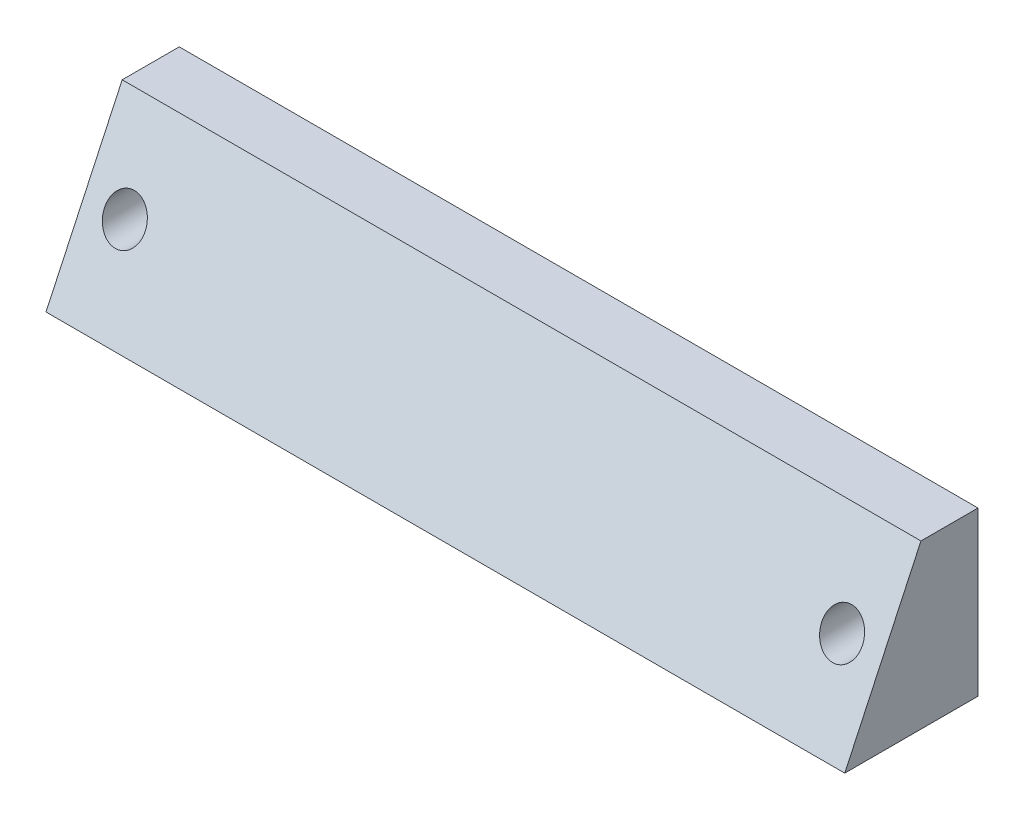
ISO-10303-21;
HEADER;
FILE_DESCRIPTION(('STEP AP214'),'2;1');
FILE_NAME('part.step','',(''),(''),'','','');
FILE_SCHEMA(('AUTOMOTIVE_DESIGN { 1 0 10303 214 1 1 1 1 }'));
ENDSEC;
DATA;
#1=APPLICATION_CONTEXT('core data for automotive mechanical design processes');
#2=APPLICATION_PROTOCOL_DEFINITION('international standard','automotive_design',2000,#1);
#3=PRODUCT_CONTEXT('',#1,'mechanical');
#4=PRODUCT('Part','Part','',(#3));
#5=PRODUCT_RELATED_PRODUCT_CATEGORY('part','',(#4));
#6=PRODUCT_DEFINITION_FORMATION('','',#4);
#7=PRODUCT_DEFINITION_CONTEXT('part definition',#1,'design');
#8=PRODUCT_DEFINITION('design','',#6,#7);
#9=PRODUCT_DEFINITION_SHAPE('','',#8);
#10=(LENGTH_UNIT() NAMED_UNIT(*) SI_UNIT(.MILLI.,.METRE.));
#11=(NAMED_UNIT(*) PLANE_ANGLE_UNIT() SI_UNIT($,.RADIAN.));
#12=(NAMED_UNIT(*) SI_UNIT($,.STERADIAN.) SOLID_ANGLE_UNIT());
#13=UNCERTAINTY_MEASURE_WITH_UNIT(LENGTH_MEASURE(1.E-05),#10,'distance_accuracy_value','');
#14=(GEOMETRIC_REPRESENTATION_CONTEXT(3) GLOBAL_UNCERTAINTY_ASSIGNED_CONTEXT((#13)) GLOBAL_UNIT_ASSIGNED_CONTEXT((#10,
#11,#12)) REPRESENTATION_CONTEXT('',''));
#15=CARTESIAN_POINT('',(0.,0.,0.));
#16=DIRECTION('',(0.,0.,1.));
#17=DIRECTION('',(1.,0.,0.));
#18=AXIS2_PLACEMENT_3D('',#15,#16,#17);
#19=CARTESIAN_POINT('',(-48.2303664921466,25.3979057591623,7.));
#20=DIRECTION('',(1.,0.,0.));
#21=DIRECTION('',(0.,0.,-1.));
#22=AXIS2_PLACEMENT_3D('',#19,#20,#21);
#23=PLANE('',#22);
#24=DIRECTION('',(0.,-1.,0.));
#25=VECTOR('',#24,1.);
#26=CARTESIAN_POINT('',(-48.2303664921466,25.3979057591623,0.));
#27=LINE('',#26,#25);
#28=CARTESIAN_POINT('',(-48.2303664921466,25.3979057591623,0.));
#29=VERTEX_POINT('',#28);
#30=CARTESIAN_POINT('',(-48.2303664921466,5.39790575916231,0.));
#31=VERTEX_POINT('',#30);
#32=EDGE_CURVE('E95',#29,#31,#27,.T.);
#33=ORIENTED_EDGE('',*,*,#32,.T.);
#34=DIRECTION('',(0.,0.,-1.));
#35=VECTOR('',#34,1.);
#36=CARTESIAN_POINT('',(-48.2303664921466,5.39790575916231,7.));
#37=LINE('',#36,#35);
#38=CARTESIAN_POINT('',(-48.2303664921466,5.39790575916231,16.3479400749064));
#39=VERTEX_POINT('',#38);
#40=EDGE_CURVE('E11',#39,#31,#37,.T.);
#41=ORIENTED_EDGE('',*,*,#40,.F.);
#42=DIRECTION('',(0.,0.905929431300559,-0.423428701794582));
#43=VECTOR('',#42,1.);
#44=CARTESIAN_POINT('',(-48.2303664921466,5.39790575916231,16.3479400749064));
#45=LINE('',#44,#43);
#46=CARTESIAN_POINT('',(-48.2303664921466,25.3979057591623,7.));
#47=VERTEX_POINT('',#46);
#48=EDGE_CURVE('E113',#39,#47,#45,.T.);
#49=ORIENTED_EDGE('',*,*,#48,.T.);
#50=DIRECTION('',(0.,0.,-1.));
#51=VECTOR('',#50,1.);
#52=CARTESIAN_POINT('',(-48.2303664921466,25.3979057591623,7.));
#53=LINE('',#52,#51);
#54=EDGE_CURVE('E90',#47,#29,#53,.T.);
#55=ORIENTED_EDGE('',*,*,#54,.T.);
#56=EDGE_LOOP('',(#33,#41,#49,#55));
#57=FACE_BOUND('',#56,.T.);
#58=ADVANCED_FACE('F39',(#57),#23,.F.);
#59=CARTESIAN_POINT('',(-48.2303664921466,5.39790575916231,7.));
#60=DIRECTION('',(0.,1.,0.));
#61=DIRECTION('',(0.,0.,1.));
#62=AXIS2_PLACEMENT_3D('',#59,#60,#61);
#63=PLANE('',#62);
#64=DIRECTION('',(1.,0.,0.));
#65=VECTOR('',#64,1.);
#66=CARTESIAN_POINT('',(-48.2303664921466,5.39790575916231,0.));
#67=LINE('',#66,#65);
#68=CARTESIAN_POINT('',(49.7696335078534,5.39790575916231,0.));
#69=VERTEX_POINT('',#68);
#70=EDGE_CURVE('E80',#31,#69,#67,.T.);
#71=ORIENTED_EDGE('',*,*,#70,.T.);
#72=DIRECTION('',(0.,0.,-1.));
#73=VECTOR('',#72,1.);
#74=CARTESIAN_POINT('',(49.7696335078534,5.39790575916231,7.));
#75=LINE('',#74,#73);
#76=CARTESIAN_POINT('',(49.7696335078534,5.39790575916231,16.3479400749064));
#77=VERTEX_POINT('',#76);
#78=EDGE_CURVE('E49',#77,#69,#75,.T.);
#79=ORIENTED_EDGE('',*,*,#78,.F.);
#80=DIRECTION('',(-1.,0.,0.));
#81=VECTOR('',#80,1.);
#82=CARTESIAN_POINT('',(49.7696335078534,5.39790575916231,16.3479400749064));
#83=LINE('',#82,#81);
#84=EDGE_CURVE('E124',#77,#39,#83,.T.);
#85=ORIENTED_EDGE('',*,*,#84,.T.);
#86=ORIENTED_EDGE('',*,*,#40,.T.);
#87=EDGE_LOOP('',(#71,#79,#85,#86));
#88=FACE_BOUND('',#87,.T.);
#89=ADVANCED_FACE('F134',(#88),#63,.F.);
#90=CARTESIAN_POINT('',(49.7696335078534,25.3979057591623,7.));
#91=DIRECTION('',(-1.,0.,0.));
#92=DIRECTION('',(0.,-1.,0.));
#93=AXIS2_PLACEMENT_3D('',#90,#91,#92);
#94=PLANE('',#93);
#95=DIRECTION('',(0.,1.,0.));
#96=VECTOR('',#95,1.);
#97=CARTESIAN_POINT('',(49.7696335078534,25.3979057591623,0.));
#98=LINE('',#97,#96);
#99=CARTESIAN_POINT('',(49.7696335078534,25.3979057591623,0.));
#100=VERTEX_POINT('',#99);
#101=EDGE_CURVE('E73',#69,#100,#98,.T.);
#102=ORIENTED_EDGE('',*,*,#101,.T.);
#103=DIRECTION('',(0.,0.,-1.));
#104=VECTOR('',#103,1.);
#105=CARTESIAN_POINT('',(49.7696335078534,25.3979057591623,7.));
#106=LINE('',#105,#104);
#107=CARTESIAN_POINT('',(49.7696335078534,25.3979057591623,7.));
#108=VERTEX_POINT('',#107);
#109=EDGE_CURVE('E57',#108,#100,#106,.T.);
#110=ORIENTED_EDGE('',*,*,#109,.F.);
#111=DIRECTION('',(0.,0.905929431300559,-0.423428701794582));
#112=VECTOR('',#111,1.);
#113=CARTESIAN_POINT('',(49.7696335078534,5.39790575916231,16.3479400749064));
#114=LINE('',#113,#112);
#115=EDGE_CURVE('E118',#77,#108,#114,.T.);
#116=ORIENTED_EDGE('',*,*,#115,.F.);
#117=ORIENTED_EDGE('',*,*,#78,.T.);
#118=EDGE_LOOP('',(#102,#110,#116,#117));
#119=FACE_BOUND('',#118,.T.);
#120=ADVANCED_FACE('F74',(#119),#94,.F.);
#121=CARTESIAN_POINT('',(-48.2303664921466,25.3979057591623,7.));
#122=DIRECTION('',(0.,-1.,0.));
#123=DIRECTION('',(0.,0.,-1.));
#124=AXIS2_PLACEMENT_3D('',#121,#122,#123);
#125=PLANE('',#124);
#126=DIRECTION('',(-1.,0.,0.));
#127=VECTOR('',#126,1.);
#128=CARTESIAN_POINT('',(-48.2303664921466,25.3979057591623,0.));
#129=LINE('',#128,#127);
#130=EDGE_CURVE('E79',#100,#29,#129,.T.);
#131=ORIENTED_EDGE('',*,*,#130,.T.);
#132=ORIENTED_EDGE('',*,*,#54,.F.);
#133=DIRECTION('',(-1.,0.,0.));
#134=VECTOR('',#133,1.);
#135=CARTESIAN_POINT('',(-48.2303664921466,25.3979057591623,7.));
#136=LINE('',#135,#134);
#137=EDGE_CURVE('E87',#108,#47,#136,.T.);
#138=ORIENTED_EDGE('',*,*,#137,.F.);
#139=ORIENTED_EDGE('',*,*,#109,.T.);
#140=EDGE_LOOP('',(#131,#132,#138,#139));
#141=FACE_BOUND('',#140,.T.);
#142=ADVANCED_FACE('F83',(#141),#125,.F.);
#143=CARTESIAN_POINT('',(0.,0.,0.));
#144=DIRECTION('',(0.,0.,1.));
#145=DIRECTION('',(1.,0.,0.));
#146=AXIS2_PLACEMENT_3D('',#143,#144,#145);
#147=PLANE('',#146);
#148=CARTESIAN_POINT('',(-43.2303664921466,15.3979057591623,0.));
#149=DIRECTION('',(0.,0.,1.));
#150=DIRECTION('',(1.,0.,0.));
#151=AXIS2_PLACEMENT_3D('',#148,#149,#150);
#152=CIRCLE('',#151,1.5);
#153=CARTESIAN_POINT('',(-41.7303664921466,15.3979057591623,0.));
#154=VERTEX_POINT('',#153);
#155=EDGE_CURVE('E237',#154,#154,#152,.T.);
#156=ORIENTED_EDGE('',*,*,#155,.T.);
#157=EDGE_LOOP('',(#156));
#158=FACE_BOUND('',#157,.T.);
#159=CARTESIAN_POINT('',(44.7696335078534,15.3979057591623,0.));
#160=DIRECTION('',(0.,0.,1.));
#161=DIRECTION('',(1.,0.,0.));
#162=AXIS2_PLACEMENT_3D('',#159,#160,#161);
#163=CIRCLE('',#162,1.5);
#164=CARTESIAN_POINT('',(46.2696335078534,15.3979057591623,0.));
#165=VERTEX_POINT('',#164);
#166=EDGE_CURVE('E238',#165,#165,#163,.T.);
#167=ORIENTED_EDGE('',*,*,#166,.T.);
#168=EDGE_LOOP('',(#167));
#169=FACE_BOUND('',#168,.T.);
#170=ORIENTED_EDGE('',*,*,#32,.F.);
#171=ORIENTED_EDGE('',*,*,#130,.F.);
#172=ORIENTED_EDGE('',*,*,#101,.F.);
#173=ORIENTED_EDGE('',*,*,#70,.F.);
#174=EDGE_LOOP('',(#170,#171,#172,#173));
#175=FACE_BOUND('',#174,.T.);
#176=ADVANCED_FACE('F93',(#158,#169,#175),#147,.F.);
#177=CARTESIAN_POINT('',(49.7696335078534,5.39790575916231,16.3479400749064));
#178=DIRECTION('',(0.,0.423428701794582,0.905929431300559));
#179=DIRECTION('',(0.,-0.905929431300559,0.423428701794582));
#180=AXIS2_PLACEMENT_3D('',#177,#178,#179);
#181=PLANE('',#180);
#182=CARTESIAN_POINT('',(44.7696335078534,15.3979057591623,11.6739700374532));
#183=DIRECTION('',(0.,0.423428701794582,0.905929431300559));
#184=DIRECTION('',(0.,0.905929431300559,-0.423428701794582));
#185=AXIS2_PLACEMENT_3D('',#182,#183,#184);
#186=ELLIPSE('',#185,2.75959684454779,2.5);
#187=CARTESIAN_POINT('',(44.7696335078534,17.8979057591623,10.5054775280899));
#188=VERTEX_POINT('',#187);
#189=EDGE_CURVE('E109',#188,#188,#186,.T.);
#190=ORIENTED_EDGE('',*,*,#189,.F.);
#191=EDGE_LOOP('',(#190));
#192=FACE_BOUND('',#191,.T.);
#193=CARTESIAN_POINT('',(-43.2303664921466,15.3979057591623,11.6739700374532));
#194=DIRECTION('',(0.,0.423428701794582,0.905929431300559));
#195=DIRECTION('',(0.,0.905929431300559,-0.423428701794582));
#196=AXIS2_PLACEMENT_3D('',#193,#194,#195);
#197=ELLIPSE('',#196,2.75959684454779,2.5);
#198=CARTESIAN_POINT('',(-43.2303664921466,17.8979057591623,10.5054775280899));
#199=VERTEX_POINT('',#198);
#200=EDGE_CURVE('E106',#199,#199,#197,.T.);
#201=ORIENTED_EDGE('',*,*,#200,.F.);
#202=EDGE_LOOP('',(#201));
#203=FACE_BOUND('',#202,.T.);
#204=ORIENTED_EDGE('',*,*,#48,.F.);
#205=ORIENTED_EDGE('',*,*,#84,.F.);
#206=ORIENTED_EDGE('',*,*,#115,.T.);
#207=ORIENTED_EDGE('',*,*,#137,.T.);
#208=EDGE_LOOP('',(#204,#205,#206,#207));
#209=FACE_BOUND('',#208,.T.);
#210=ADVANCED_FACE('F138',(#192,#203,#209),#181,.T.);
#211=CARTESIAN_POINT('',(-43.2303664921466,15.3979057591623,104.));
#212=DIRECTION('',(0.,0.,-1.));
#213=DIRECTION('',(-1.,0.,0.));
#214=AXIS2_PLACEMENT_3D('',#211,#212,#213);
#215=CYLINDRICAL_SURFACE('',#214,2.5);
#216=ORIENTED_EDGE('',*,*,#200,.T.);
#217=EDGE_LOOP('',(#216));
#218=FACE_BOUND('',#217,.T.);
#219=CARTESIAN_POINT('',(-43.2303664921466,15.3979057591623,6.));
#220=DIRECTION('',(0.,0.,-1.));
#221=DIRECTION('',(-1.,0.,0.));
#222=AXIS2_PLACEMENT_3D('',#219,#220,#221);
#223=CIRCLE('',#222,2.5);
#224=CARTESIAN_POINT('',(-45.7303664921466,15.3979057591623,6.));
#225=VERTEX_POINT('',#224);
#226=EDGE_CURVE('E226',#225,#225,#223,.T.);
#227=ORIENTED_EDGE('',*,*,#226,.T.);
#228=EDGE_LOOP('',(#227));
#229=FACE_BOUND('',#228,.T.);
#230=ADVANCED_FACE('F141',(#218,#229),#215,.F.);
#231=CARTESIAN_POINT('',(-43.2303664921466,15.3979057591623,6.));
#232=DIRECTION('',(0.,0.,-1.));
#233=DIRECTION('',(-1.,0.,0.));
#234=AXIS2_PLACEMENT_3D('',#231,#232,#233);
#235=PLANE('',#234);
#236=CARTESIAN_POINT('',(-43.2303664921466,15.3979057591623,6.00000000000001));
#237=DIRECTION('',(0.,0.,-1.));
#238=DIRECTION('',(-1.,0.,0.));
#239=AXIS2_PLACEMENT_3D('',#236,#237,#238);
#240=CIRCLE('',#239,1.5);
#241=CARTESIAN_POINT('',(-44.7303664921466,15.3979057591623,6.00000000000001));
#242=VERTEX_POINT('',#241);
#243=EDGE_CURVE('E223',#242,#242,#240,.F.);
#244=ORIENTED_EDGE('',*,*,#243,.F.);
#245=EDGE_LOOP('',(#244));
#246=FACE_BOUND('',#245,.T.);
#247=ORIENTED_EDGE('',*,*,#226,.F.);
#248=EDGE_LOOP('',(#247));
#249=FACE_BOUND('',#248,.T.);
#250=ADVANCED_FACE('F148',(#246,#249),#235,.F.);
#251=CARTESIAN_POINT('',(44.7696335078534,15.3979057591623,104.));
#252=DIRECTION('',(0.,0.,-1.));
#253=DIRECTION('',(-1.,0.,0.));
#254=AXIS2_PLACEMENT_3D('',#251,#252,#253);
#255=CYLINDRICAL_SURFACE('',#254,2.5);
#256=ORIENTED_EDGE('',*,*,#189,.T.);
#257=EDGE_LOOP('',(#256));
#258=FACE_BOUND('',#257,.T.);
#259=CARTESIAN_POINT('',(44.7696335078534,15.3979057591623,6.));
#260=DIRECTION('',(0.,0.,-1.));
#261=DIRECTION('',(-1.,0.,0.));
#262=AXIS2_PLACEMENT_3D('',#259,#260,#261);
#263=CIRCLE('',#262,2.5);
#264=CARTESIAN_POINT('',(42.2696335078534,15.3979057591623,6.));
#265=VERTEX_POINT('',#264);
#266=EDGE_CURVE('E110',#265,#265,#263,.T.);
#267=ORIENTED_EDGE('',*,*,#266,.T.);
#268=EDGE_LOOP('',(#267));
#269=FACE_BOUND('',#268,.T.);
#270=ADVANCED_FACE('F179',(#258,#269),#255,.F.);
#271=CARTESIAN_POINT('',(44.7696335078534,15.3979057591623,6.));
#272=DIRECTION('',(0.,0.,-1.));
#273=DIRECTION('',(-1.,0.,0.));
#274=AXIS2_PLACEMENT_3D('',#271,#272,#273);
#275=PLANE('',#274);
#276=CARTESIAN_POINT('',(44.7696335078534,15.3979057591623,6.00000000000001));
#277=DIRECTION('',(0.,0.,-1.));
#278=DIRECTION('',(-1.,0.,0.));
#279=AXIS2_PLACEMENT_3D('',#276,#277,#278);
#280=CIRCLE('',#279,1.5);
#281=CARTESIAN_POINT('',(43.2696335078534,15.3979057591623,6.00000000000001));
#282=VERTEX_POINT('',#281);
#283=EDGE_CURVE('E42',#282,#282,#280,.F.);
#284=ORIENTED_EDGE('',*,*,#283,.F.);
#285=EDGE_LOOP('',(#284));
#286=FACE_BOUND('',#285,.T.);
#287=ORIENTED_EDGE('',*,*,#266,.F.);
#288=EDGE_LOOP('',(#287));
#289=FACE_BOUND('',#288,.T.);
#290=ADVANCED_FACE('F184',(#286,#289),#275,.F.);
#291=CARTESIAN_POINT('',(44.7696335078534,15.3979057591623,98.));
#292=DIRECTION('',(0.,0.,-1.));
#293=DIRECTION('',(-1.,0.,0.));
#294=AXIS2_PLACEMENT_3D('',#291,#292,#293);
#295=CYLINDRICAL_SURFACE('',#294,1.5);
#296=ORIENTED_EDGE('',*,*,#166,.F.);
#297=EDGE_LOOP('',(#296));
#298=FACE_BOUND('',#297,.T.);
#299=ORIENTED_EDGE('',*,*,#283,.T.);
#300=EDGE_LOOP('',(#299));
#301=FACE_BOUND('',#300,.T.);
#302=ADVANCED_FACE('F189',(#298,#301),#295,.F.);
#303=CARTESIAN_POINT('',(-43.2303664921466,15.3979057591623,98.));
#304=DIRECTION('',(0.,0.,-1.));
#305=DIRECTION('',(-1.,0.,0.));
#306=AXIS2_PLACEMENT_3D('',#303,#304,#305);
#307=CYLINDRICAL_SURFACE('',#306,1.5);
#308=ORIENTED_EDGE('',*,*,#155,.F.);
#309=EDGE_LOOP('',(#308));
#310=FACE_BOUND('',#309,.T.);
#311=ORIENTED_EDGE('',*,*,#243,.T.);
#312=EDGE_LOOP('',(#311));
#313=FACE_BOUND('',#312,.T.);
#314=ADVANCED_FACE('F199',(#310,#313),#307,.F.);
#315=CLOSED_SHELL('',(#58,#89,#120,#142,#176,#210,#230,#250,#270,#290,#302,#314));
#316=MANIFOLD_SOLID_BREP('B2',#315);
#317=ADVANCED_BREP_SHAPE_REPRESENTATION('',(#18,#316),#14);
#318=SHAPE_DEFINITION_REPRESENTATION(#9,#317);
ENDSEC;
END-ISO-10303-21;
